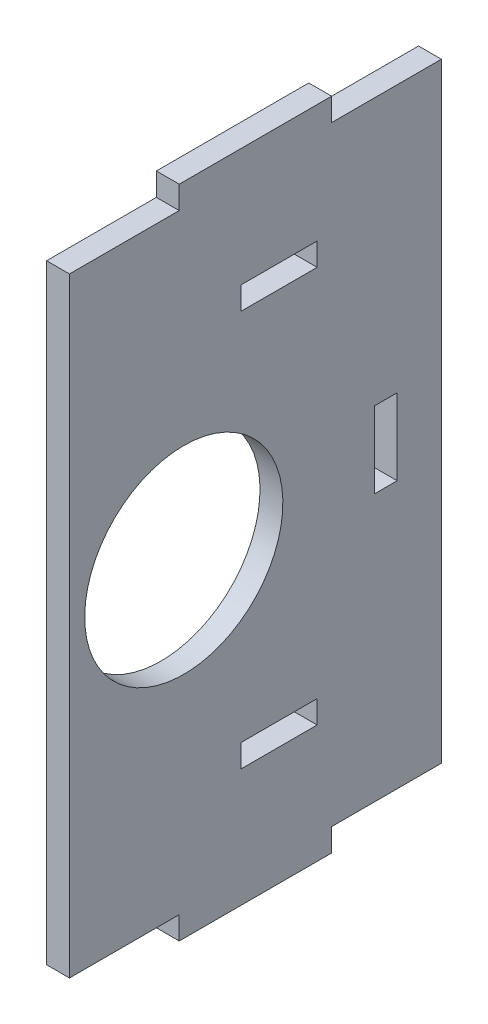
ISO-10303-21;
HEADER;
FILE_DESCRIPTION(('STEP AP214'),'2;1');
FILE_NAME('part.step','',(''),(''),'','','');
FILE_SCHEMA(('AUTOMOTIVE_DESIGN { 1 0 10303 214 1 1 1 1 }'));
ENDSEC;
DATA;
#1=APPLICATION_CONTEXT('core data for automotive mechanical design processes');
#2=APPLICATION_PROTOCOL_DEFINITION('international standard','automotive_design',2000,#1);
#3=PRODUCT_CONTEXT('',#1,'mechanical');
#4=PRODUCT('Part','Part','',(#3));
#5=PRODUCT_RELATED_PRODUCT_CATEGORY('part','',(#4));
#6=PRODUCT_DEFINITION_FORMATION('','',#4);
#7=PRODUCT_DEFINITION_CONTEXT('part definition',#1,'design');
#8=PRODUCT_DEFINITION('design','',#6,#7);
#9=PRODUCT_DEFINITION_SHAPE('','',#8);
#10=(LENGTH_UNIT() NAMED_UNIT(*) SI_UNIT(.MILLI.,.METRE.));
#11=(NAMED_UNIT(*) PLANE_ANGLE_UNIT() SI_UNIT($,.RADIAN.));
#12=(NAMED_UNIT(*) SI_UNIT($,.STERADIAN.) SOLID_ANGLE_UNIT());
#13=UNCERTAINTY_MEASURE_WITH_UNIT(LENGTH_MEASURE(1.E-05),#10,'distance_accuracy_value','');
#14=(GEOMETRIC_REPRESENTATION_CONTEXT(3) GLOBAL_UNCERTAINTY_ASSIGNED_CONTEXT((#13)) GLOBAL_UNIT_ASSIGNED_CONTEXT((#10,
#11,#12)) REPRESENTATION_CONTEXT('',''));
#15=CARTESIAN_POINT('',(0.,0.,0.));
#16=DIRECTION('',(0.,0.,1.));
#17=DIRECTION('',(1.,0.,0.));
#18=AXIS2_PLACEMENT_3D('',#15,#16,#17);
#19=CARTESIAN_POINT('',(-3.,-27.5,16.3));
#20=DIRECTION('',(0.,1.,0.));
#21=DIRECTION('',(0.,0.,1.));
#22=AXIS2_PLACEMENT_3D('',#19,#20,#21);
#23=PLANE('',#22);
#24=DIRECTION('',(0.,0.,1.));
#25=VECTOR('',#24,1.);
#26=CARTESIAN_POINT('',(0.,-27.5,16.3));
#27=LINE('',#26,#25);
#28=CARTESIAN_POINT('',(0.,-27.5,16.3));
#29=VERTEX_POINT('',#28);
#30=CARTESIAN_POINT('',(0.,-27.5,26.3));
#31=VERTEX_POINT('',#30);
#32=EDGE_CURVE('E292',#29,#31,#27,.T.);
#33=ORIENTED_EDGE('',*,*,#32,.F.);
#34=DIRECTION('',(1.,0.,0.));
#35=VECTOR('',#34,1.);
#36=CARTESIAN_POINT('',(-3.,-27.5,16.3));
#37=LINE('',#36,#35);
#38=CARTESIAN_POINT('',(-3.,-27.5,16.3));
#39=VERTEX_POINT('',#38);
#40=EDGE_CURVE('E197',#39,#29,#37,.T.);
#41=ORIENTED_EDGE('',*,*,#40,.F.);
#42=DIRECTION('',(0.,0.,1.));
#43=VECTOR('',#42,1.);
#44=CARTESIAN_POINT('',(-3.,-27.5,16.3));
#45=LINE('',#44,#43);
#46=CARTESIAN_POINT('',(-3.,-27.5,26.3));
#47=VERTEX_POINT('',#46);
#48=EDGE_CURVE('E193',#39,#47,#45,.T.);
#49=ORIENTED_EDGE('',*,*,#48,.T.);
#50=DIRECTION('',(1.,0.,0.));
#51=VECTOR('',#50,1.);
#52=CARTESIAN_POINT('',(-3.,-27.5,26.3));
#53=LINE('',#52,#51);
#54=EDGE_CURVE('E10',#47,#31,#53,.T.);
#55=ORIENTED_EDGE('',*,*,#54,.T.);
#56=EDGE_LOOP('',(#33,#41,#49,#55));
#57=FACE_BOUND('',#56,.T.);
#58=ADVANCED_FACE('F16',(#57),#23,.T.);
#59=CARTESIAN_POINT('',(-3.,-27.5,26.3));
#60=DIRECTION('',(0.,0.,-1.));
#61=DIRECTION('',(0.,1.,0.));
#62=AXIS2_PLACEMENT_3D('',#59,#60,#61);
#63=PLANE('',#62);
#64=DIRECTION('',(0.,1.,0.));
#65=VECTOR('',#64,1.);
#66=CARTESIAN_POINT('',(0.,-27.5,26.3));
#67=LINE('',#66,#65);
#68=CARTESIAN_POINT('',(0.,-24.5,26.3));
#69=VERTEX_POINT('',#68);
#70=EDGE_CURVE('E184',#31,#69,#67,.T.);
#71=ORIENTED_EDGE('',*,*,#70,.F.);
#72=ORIENTED_EDGE('',*,*,#54,.F.);
#73=DIRECTION('',(0.,1.,0.));
#74=VECTOR('',#73,1.);
#75=CARTESIAN_POINT('',(-3.,-27.5,26.3));
#76=LINE('',#75,#74);
#77=CARTESIAN_POINT('',(-3.,-24.5,26.3));
#78=VERTEX_POINT('',#77);
#79=EDGE_CURVE('E181',#47,#78,#76,.T.);
#80=ORIENTED_EDGE('',*,*,#79,.T.);
#81=DIRECTION('',(1.,0.,0.));
#82=VECTOR('',#81,1.);
#83=CARTESIAN_POINT('',(-3.,-24.5,26.3));
#84=LINE('',#83,#82);
#85=EDGE_CURVE('E26',#78,#69,#84,.T.);
#86=ORIENTED_EDGE('',*,*,#85,.T.);
#87=EDGE_LOOP('',(#71,#72,#80,#86));
#88=FACE_BOUND('',#87,.T.);
#89=ADVANCED_FACE('F180',(#88),#63,.T.);
#90=CARTESIAN_POINT('',(-3.,-24.5,26.3));
#91=DIRECTION('',(0.,-1.,0.));
#92=DIRECTION('',(0.,0.,-1.));
#93=AXIS2_PLACEMENT_3D('',#90,#91,#92);
#94=PLANE('',#93);
#95=DIRECTION('',(0.,0.,-1.));
#96=VECTOR('',#95,1.);
#97=CARTESIAN_POINT('',(0.,-24.5,26.3));
#98=LINE('',#97,#96);
#99=CARTESIAN_POINT('',(0.,-24.5,16.3));
#100=VERTEX_POINT('',#99);
#101=EDGE_CURVE('E299',#69,#100,#98,.T.);
#102=ORIENTED_EDGE('',*,*,#101,.F.);
#103=ORIENTED_EDGE('',*,*,#85,.F.);
#104=DIRECTION('',(0.,0.,-1.));
#105=VECTOR('',#104,1.);
#106=CARTESIAN_POINT('',(-3.,-24.5,26.3));
#107=LINE('',#106,#105);
#108=CARTESIAN_POINT('',(-3.,-24.5,16.3));
#109=VERTEX_POINT('',#108);
#110=EDGE_CURVE('E194',#78,#109,#107,.T.);
#111=ORIENTED_EDGE('',*,*,#110,.T.);
#112=DIRECTION('',(1.,0.,0.));
#113=VECTOR('',#112,1.);
#114=CARTESIAN_POINT('',(-3.,-24.5,16.3));
#115=LINE('',#114,#113);
#116=EDGE_CURVE('E107',#109,#100,#115,.T.);
#117=ORIENTED_EDGE('',*,*,#116,.T.);
#118=EDGE_LOOP('',(#102,#103,#111,#117));
#119=FACE_BOUND('',#118,.T.);
#120=ADVANCED_FACE('F417',(#119),#94,.T.);
#121=CARTESIAN_POINT('',(-3.,27.5,26.3));
#122=DIRECTION('',(0.,0.,1.));
#123=DIRECTION('',(0.,-1.,0.));
#124=AXIS2_PLACEMENT_3D('',#121,#122,#123);
#125=PLANE('',#124);
#126=DIRECTION('',(0.,-1.,0.));
#127=VECTOR('',#126,1.);
#128=CARTESIAN_POINT('',(0.,27.5,26.3));
#129=LINE('',#128,#127);
#130=CARTESIAN_POINT('',(0.,27.5,26.3));
#131=VERTEX_POINT('',#130);
#132=CARTESIAN_POINT('',(0.,24.5,26.3));
#133=VERTEX_POINT('',#132);
#134=EDGE_CURVE('E288',#131,#133,#129,.T.);
#135=ORIENTED_EDGE('',*,*,#134,.T.);
#136=DIRECTION('',(1.,0.,0.));
#137=VECTOR('',#136,1.);
#138=CARTESIAN_POINT('',(-3.,24.5,26.3));
#139=LINE('',#138,#137);
#140=CARTESIAN_POINT('',(-3.,24.5,26.3));
#141=VERTEX_POINT('',#140);
#142=EDGE_CURVE('E314',#141,#133,#139,.T.);
#143=ORIENTED_EDGE('',*,*,#142,.F.);
#144=DIRECTION('',(0.,-1.,0.));
#145=VECTOR('',#144,1.);
#146=CARTESIAN_POINT('',(-3.,27.5,26.3));
#147=LINE('',#146,#145);
#148=CARTESIAN_POINT('',(-3.,27.5,26.3));
#149=VERTEX_POINT('',#148);
#150=EDGE_CURVE('E200',#149,#141,#147,.T.);
#151=ORIENTED_EDGE('',*,*,#150,.F.);
#152=DIRECTION('',(1.,0.,0.));
#153=VECTOR('',#152,1.);
#154=CARTESIAN_POINT('',(-3.,27.5,26.3));
#155=LINE('',#154,#153);
#156=EDGE_CURVE('E313',#149,#131,#155,.T.);
#157=ORIENTED_EDGE('',*,*,#156,.T.);
#158=EDGE_LOOP('',(#135,#143,#151,#157));
#159=FACE_BOUND('',#158,.T.);
#160=ADVANCED_FACE('F409',(#159),#125,.F.);
#161=CARTESIAN_POINT('',(-3.,27.5,16.3));
#162=DIRECTION('',(0.,1.,0.));
#163=DIRECTION('',(0.,0.,1.));
#164=AXIS2_PLACEMENT_3D('',#161,#162,#163);
#165=PLANE('',#164);
#166=DIRECTION('',(0.,0.,1.));
#167=VECTOR('',#166,1.);
#168=CARTESIAN_POINT('',(0.,27.5,16.3));
#169=LINE('',#168,#167);
#170=CARTESIAN_POINT('',(0.,27.5,16.3));
#171=VERTEX_POINT('',#170);
#172=EDGE_CURVE('E276',#171,#131,#169,.T.);
#173=ORIENTED_EDGE('',*,*,#172,.T.);
#174=ORIENTED_EDGE('',*,*,#156,.F.);
#175=DIRECTION('',(0.,0.,1.));
#176=VECTOR('',#175,1.);
#177=CARTESIAN_POINT('',(-3.,27.5,16.3));
#178=LINE('',#177,#176);
#179=CARTESIAN_POINT('',(-3.,27.5,16.3));
#180=VERTEX_POINT('',#179);
#181=EDGE_CURVE('E389',#180,#149,#178,.T.);
#182=ORIENTED_EDGE('',*,*,#181,.F.);
#183=DIRECTION('',(1.,0.,0.));
#184=VECTOR('',#183,1.);
#185=CARTESIAN_POINT('',(-3.,27.5,16.3));
#186=LINE('',#185,#184);
#187=EDGE_CURVE('E318',#180,#171,#186,.T.);
#188=ORIENTED_EDGE('',*,*,#187,.T.);
#189=EDGE_LOOP('',(#173,#174,#182,#188));
#190=FACE_BOUND('',#189,.T.);
#191=ADVANCED_FACE('F407',(#190),#165,.F.);
#192=CARTESIAN_POINT('',(-3.,24.5,16.3));
#193=DIRECTION('',(0.,0.,-1.));
#194=DIRECTION('',(-1.,0.,0.));
#195=AXIS2_PLACEMENT_3D('',#192,#193,#194);
#196=PLANE('',#195);
#197=DIRECTION('',(0.,1.,0.));
#198=VECTOR('',#197,1.);
#199=CARTESIAN_POINT('',(0.,24.5,16.3));
#200=LINE('',#199,#198);
#201=CARTESIAN_POINT('',(0.,24.5,16.3));
#202=VERTEX_POINT('',#201);
#203=EDGE_CURVE('E280',#202,#171,#200,.T.);
#204=ORIENTED_EDGE('',*,*,#203,.T.);
#205=ORIENTED_EDGE('',*,*,#187,.F.);
#206=DIRECTION('',(0.,1.,0.));
#207=VECTOR('',#206,1.);
#208=CARTESIAN_POINT('',(-3.,24.5,16.3));
#209=LINE('',#208,#207);
#210=CARTESIAN_POINT('',(-3.,24.5,16.3));
#211=VERTEX_POINT('',#210);
#212=EDGE_CURVE('E392',#211,#180,#209,.T.);
#213=ORIENTED_EDGE('',*,*,#212,.F.);
#214=DIRECTION('',(1.,0.,0.));
#215=VECTOR('',#214,1.);
#216=CARTESIAN_POINT('',(-3.,24.5,16.3));
#217=LINE('',#216,#215);
#218=EDGE_CURVE('E316',#211,#202,#217,.T.);
#219=ORIENTED_EDGE('',*,*,#218,.T.);
#220=EDGE_LOOP('',(#204,#205,#213,#219));
#221=FACE_BOUND('',#220,.T.);
#222=ADVANCED_FACE('F403',(#221),#196,.F.);
#223=CARTESIAN_POINT('',(-3.,40.,48.8));
#224=DIRECTION('',(0.,0.,1.));
#225=DIRECTION('',(1.,0.,0.));
#226=AXIS2_PLACEMENT_3D('',#223,#224,#225);
#227=PLANE('',#226);
#228=DIRECTION('',(0.,-1.,0.));
#229=VECTOR('',#228,1.);
#230=CARTESIAN_POINT('',(0.,40.,48.8));
#231=LINE('',#230,#229);
#232=CARTESIAN_POINT('',(0.,40.,48.8));
#233=VERTEX_POINT('',#232);
#234=CARTESIAN_POINT('',(0.,-40.,48.8));
#235=VERTEX_POINT('',#234);
#236=EDGE_CURVE('E217',#233,#235,#231,.T.);
#237=ORIENTED_EDGE('',*,*,#236,.F.);
#238=DIRECTION('',(1.,0.,0.));
#239=VECTOR('',#238,1.);
#240=CARTESIAN_POINT('',(-3.,40.,48.8));
#241=LINE('',#240,#239);
#242=CARTESIAN_POINT('',(-3.,40.,48.8));
#243=VERTEX_POINT('',#242);
#244=EDGE_CURVE('E327',#243,#233,#241,.T.);
#245=ORIENTED_EDGE('',*,*,#244,.F.);
#246=DIRECTION('',(0.,-1.,0.));
#247=VECTOR('',#246,1.);
#248=CARTESIAN_POINT('',(-3.,40.,48.8));
#249=LINE('',#248,#247);
#250=CARTESIAN_POINT('',(-3.,-40.,48.8));
#251=VERTEX_POINT('',#250);
#252=EDGE_CURVE('E309',#243,#251,#249,.T.);
#253=ORIENTED_EDGE('',*,*,#252,.T.);
#254=DIRECTION('',(1.,0.,0.));
#255=VECTOR('',#254,1.);
#256=CARTESIAN_POINT('',(-3.,-40.,48.8));
#257=LINE('',#256,#255);
#258=EDGE_CURVE('E20',#251,#235,#257,.T.);
#259=ORIENTED_EDGE('',*,*,#258,.T.);
#260=EDGE_LOOP('',(#237,#245,#253,#259));
#261=FACE_BOUND('',#260,.T.);
#262=ADVANCED_FACE('F18',(#261),#227,.T.);
#263=CARTESIAN_POINT('',(-3.,-40.,48.8));
#264=DIRECTION('',(0.,-1.,0.));
#265=DIRECTION('',(0.,0.,-1.));
#266=AXIS2_PLACEMENT_3D('',#263,#264,#265);
#267=PLANE('',#266);
#268=DIRECTION('',(0.,0.,-1.));
#269=VECTOR('',#268,1.);
#270=CARTESIAN_POINT('',(0.,-40.,48.8));
#271=LINE('',#270,#269);
#272=CARTESIAN_POINT('',(0.,-40.,34.4));
#273=VERTEX_POINT('',#272);
#274=EDGE_CURVE('E212',#235,#273,#271,.T.);
#275=ORIENTED_EDGE('',*,*,#274,.F.);
#276=ORIENTED_EDGE('',*,*,#258,.F.);
#277=DIRECTION('',(0.,0.,-1.));
#278=VECTOR('',#277,1.);
#279=CARTESIAN_POINT('',(-3.,-40.,48.8));
#280=LINE('',#279,#278);
#281=CARTESIAN_POINT('',(-3.,-40.,34.4));
#282=VERTEX_POINT('',#281);
#283=EDGE_CURVE('E372',#251,#282,#280,.T.);
#284=ORIENTED_EDGE('',*,*,#283,.T.);
#285=DIRECTION('',(1.,0.,0.));
#286=VECTOR('',#285,1.);
#287=CARTESIAN_POINT('',(-3.,-40.,34.4));
#288=LINE('',#287,#286);
#289=EDGE_CURVE('E347',#282,#273,#288,.T.);
#290=ORIENTED_EDGE('',*,*,#289,.T.);
#291=EDGE_LOOP('',(#275,#276,#284,#290));
#292=FACE_BOUND('',#291,.T.);
#293=ADVANCED_FACE('F353',(#292),#267,.T.);
#294=CARTESIAN_POINT('',(-3.,-40.,34.4));
#295=DIRECTION('',(0.,0.,1.));
#296=DIRECTION('',(1.,0.,0.));
#297=AXIS2_PLACEMENT_3D('',#294,#295,#296);
#298=PLANE('',#297);
#299=DIRECTION('',(0.,-1.,0.));
#300=VECTOR('',#299,1.);
#301=CARTESIAN_POINT('',(0.,-40.,34.4));
#302=LINE('',#301,#300);
#303=CARTESIAN_POINT('',(0.,-43.,34.4));
#304=VERTEX_POINT('',#303);
#305=EDGE_CURVE('E216',#273,#304,#302,.T.);
#306=ORIENTED_EDGE('',*,*,#305,.F.);
#307=ORIENTED_EDGE('',*,*,#289,.F.);
#308=DIRECTION('',(0.,-1.,0.));
#309=VECTOR('',#308,1.);
#310=CARTESIAN_POINT('',(-3.,-40.,34.4));
#311=LINE('',#310,#309);
#312=CARTESIAN_POINT('',(-3.,-43.,34.4));
#313=VERTEX_POINT('',#312);
#314=EDGE_CURVE('E374',#282,#313,#311,.T.);
#315=ORIENTED_EDGE('',*,*,#314,.T.);
#316=DIRECTION('',(1.,0.,0.));
#317=VECTOR('',#316,1.);
#318=CARTESIAN_POINT('',(-3.,-43.,34.4));
#319=LINE('',#318,#317);
#320=EDGE_CURVE('E346',#313,#304,#319,.T.);
#321=ORIENTED_EDGE('',*,*,#320,.T.);
#322=EDGE_LOOP('',(#306,#307,#315,#321));
#323=FACE_BOUND('',#322,.T.);
#324=ADVANCED_FACE('F489',(#323),#298,.T.);
#325=CARTESIAN_POINT('',(-3.,-43.,34.4));
#326=DIRECTION('',(0.,-1.,0.));
#327=DIRECTION('',(0.,0.,-1.));
#328=AXIS2_PLACEMENT_3D('',#325,#326,#327);
#329=PLANE('',#328);
#330=DIRECTION('',(0.,0.,-1.));
#331=VECTOR('',#330,1.);
#332=CARTESIAN_POINT('',(0.,-43.,34.4));
#333=LINE('',#332,#331);
#334=CARTESIAN_POINT('',(0.,-43.,14.4));
#335=VERTEX_POINT('',#334);
#336=EDGE_CURVE('E221',#304,#335,#333,.T.);
#337=ORIENTED_EDGE('',*,*,#336,.F.);
#338=ORIENTED_EDGE('',*,*,#320,.F.);
#339=DIRECTION('',(0.,0.,-1.));
#340=VECTOR('',#339,1.);
#341=CARTESIAN_POINT('',(-3.,-43.,34.4));
#342=LINE('',#341,#340);
#343=CARTESIAN_POINT('',(-3.,-43.,14.4));
#344=VERTEX_POINT('',#343);
#345=EDGE_CURVE('E855',#313,#344,#342,.T.);
#346=ORIENTED_EDGE('',*,*,#345,.T.);
#347=DIRECTION('',(1.,0.,0.));
#348=VECTOR('',#347,1.);
#349=CARTESIAN_POINT('',(-3.,-43.,14.4));
#350=LINE('',#349,#348);
#351=EDGE_CURVE('E344',#344,#335,#350,.T.);
#352=ORIENTED_EDGE('',*,*,#351,.T.);
#353=EDGE_LOOP('',(#337,#338,#346,#352));
#354=FACE_BOUND('',#353,.T.);
#355=ADVANCED_FACE('F485',(#354),#329,.T.);
#356=CARTESIAN_POINT('',(-3.,-43.,14.4));
#357=DIRECTION('',(0.,0.,-1.));
#358=DIRECTION('',(0.,1.,0.));
#359=AXIS2_PLACEMENT_3D('',#356,#357,#358);
#360=PLANE('',#359);
#361=DIRECTION('',(0.,1.,0.));
#362=VECTOR('',#361,1.);
#363=CARTESIAN_POINT('',(0.,-43.,14.4));
#364=LINE('',#363,#362);
#365=CARTESIAN_POINT('',(0.,-40.,14.4));
#366=VERTEX_POINT('',#365);
#367=EDGE_CURVE('E225',#335,#366,#364,.T.);
#368=ORIENTED_EDGE('',*,*,#367,.F.);
#369=ORIENTED_EDGE('',*,*,#351,.F.);
#370=DIRECTION('',(0.,1.,0.));
#371=VECTOR('',#370,1.);
#372=CARTESIAN_POINT('',(-3.,-43.,14.4));
#373=LINE('',#372,#371);
#374=CARTESIAN_POINT('',(-3.,-40.,14.4));
#375=VERTEX_POINT('',#374);
#376=EDGE_CURVE('E859',#344,#375,#373,.T.);
#377=ORIENTED_EDGE('',*,*,#376,.T.);
#378=DIRECTION('',(1.,0.,0.));
#379=VECTOR('',#378,1.);
#380=CARTESIAN_POINT('',(-3.,-40.,14.4));
#381=LINE('',#380,#379);
#382=EDGE_CURVE('E342',#375,#366,#381,.T.);
#383=ORIENTED_EDGE('',*,*,#382,.T.);
#384=EDGE_LOOP('',(#368,#369,#377,#383));
#385=FACE_BOUND('',#384,.T.);
#386=ADVANCED_FACE('F481',(#385),#360,.T.);
#387=CARTESIAN_POINT('',(-3.,-40.,14.4));
#388=DIRECTION('',(0.,-1.,0.));
#389=DIRECTION('',(0.,0.,-1.));
#390=AXIS2_PLACEMENT_3D('',#387,#388,#389);
#391=PLANE('',#390);
#392=DIRECTION('',(0.,0.,-1.));
#393=VECTOR('',#392,1.);
#394=CARTESIAN_POINT('',(0.,-40.,14.4));
#395=LINE('',#394,#393);
#396=CARTESIAN_POINT('',(0.,-40.,0.));
#397=VERTEX_POINT('',#396);
#398=EDGE_CURVE('E229',#366,#397,#395,.T.);
#399=ORIENTED_EDGE('',*,*,#398,.F.);
#400=ORIENTED_EDGE('',*,*,#382,.F.);
#401=DIRECTION('',(0.,0.,-1.));
#402=VECTOR('',#401,1.);
#403=CARTESIAN_POINT('',(-3.,-40.,14.4));
#404=LINE('',#403,#402);
#405=CARTESIAN_POINT('',(-3.,-40.,0.));
#406=VERTEX_POINT('',#405);
#407=EDGE_CURVE('E883',#375,#406,#404,.T.);
#408=ORIENTED_EDGE('',*,*,#407,.T.);
#409=DIRECTION('',(1.,0.,0.));
#410=VECTOR('',#409,1.);
#411=CARTESIAN_POINT('',(-3.,-40.,0.));
#412=LINE('',#411,#410);
#413=EDGE_CURVE('E340',#406,#397,#412,.T.);
#414=ORIENTED_EDGE('',*,*,#413,.T.);
#415=EDGE_LOOP('',(#399,#400,#408,#414));
#416=FACE_BOUND('',#415,.T.);
#417=ADVANCED_FACE('F477',(#416),#391,.T.);
#418=CARTESIAN_POINT('',(-3.,-40.,0.));
#419=DIRECTION('',(0.,0.,-1.));
#420=DIRECTION('',(-1.,0.,0.));
#421=AXIS2_PLACEMENT_3D('',#418,#419,#420);
#422=PLANE('',#421);
#423=DIRECTION('',(0.,1.,0.));
#424=VECTOR('',#423,1.);
#425=CARTESIAN_POINT('',(0.,-40.,0.));
#426=LINE('',#425,#424);
#427=CARTESIAN_POINT('',(0.,40.,0.));
#428=VERTEX_POINT('',#427);
#429=EDGE_CURVE('E233',#397,#428,#426,.T.);
#430=ORIENTED_EDGE('',*,*,#429,.F.);
#431=ORIENTED_EDGE('',*,*,#413,.F.);
#432=DIRECTION('',(0.,1.,0.));
#433=VECTOR('',#432,1.);
#434=CARTESIAN_POINT('',(-3.,-40.,0.));
#435=LINE('',#434,#433);
#436=CARTESIAN_POINT('',(-3.,40.,0.));
#437=VERTEX_POINT('',#436);
#438=EDGE_CURVE('E866',#406,#437,#435,.T.);
#439=ORIENTED_EDGE('',*,*,#438,.T.);
#440=DIRECTION('',(1.,0.,0.));
#441=VECTOR('',#440,1.);
#442=CARTESIAN_POINT('',(-3.,40.,0.));
#443=LINE('',#442,#441);
#444=EDGE_CURVE('E338',#437,#428,#443,.T.);
#445=ORIENTED_EDGE('',*,*,#444,.T.);
#446=EDGE_LOOP('',(#430,#431,#439,#445));
#447=FACE_BOUND('',#446,.T.);
#448=ADVANCED_FACE('F473',(#447),#422,.T.);
#449=CARTESIAN_POINT('',(-3.,40.,0.));
#450=DIRECTION('',(0.,1.,0.));
#451=DIRECTION('',(0.,0.,1.));
#452=AXIS2_PLACEMENT_3D('',#449,#450,#451);
#453=PLANE('',#452);
#454=DIRECTION('',(0.,0.,1.));
#455=VECTOR('',#454,1.);
#456=CARTESIAN_POINT('',(0.,40.,0.));
#457=LINE('',#456,#455);
#458=CARTESIAN_POINT('',(0.,40.,14.4));
#459=VERTEX_POINT('',#458);
#460=EDGE_CURVE('E237',#428,#459,#457,.T.);
#461=ORIENTED_EDGE('',*,*,#460,.F.);
#462=ORIENTED_EDGE('',*,*,#444,.F.);
#463=DIRECTION('',(0.,0.,1.));
#464=VECTOR('',#463,1.);
#465=CARTESIAN_POINT('',(-3.,40.,0.));
#466=LINE('',#465,#464);
#467=CARTESIAN_POINT('',(-3.,40.,14.4));
#468=VERTEX_POINT('',#467);
#469=EDGE_CURVE('E870',#437,#468,#466,.T.);
#470=ORIENTED_EDGE('',*,*,#469,.T.);
#471=DIRECTION('',(1.,0.,0.));
#472=VECTOR('',#471,1.);
#473=CARTESIAN_POINT('',(-3.,40.,14.4));
#474=LINE('',#473,#472);
#475=EDGE_CURVE('E336',#468,#459,#474,.T.);
#476=ORIENTED_EDGE('',*,*,#475,.T.);
#477=EDGE_LOOP('',(#461,#462,#470,#476));
#478=FACE_BOUND('',#477,.T.);
#479=ADVANCED_FACE('F469',(#478),#453,.T.);
#480=CARTESIAN_POINT('',(-3.,40.,14.4));
#481=DIRECTION('',(0.,0.,-1.));
#482=DIRECTION('',(0.,1.,0.));
#483=AXIS2_PLACEMENT_3D('',#480,#481,#482);
#484=PLANE('',#483);
#485=DIRECTION('',(0.,1.,0.));
#486=VECTOR('',#485,1.);
#487=CARTESIAN_POINT('',(0.,40.,14.4));
#488=LINE('',#487,#486);
#489=CARTESIAN_POINT('',(0.,43.,14.4));
#490=VERTEX_POINT('',#489);
#491=EDGE_CURVE('E241',#459,#490,#488,.T.);
#492=ORIENTED_EDGE('',*,*,#491,.F.);
#493=ORIENTED_EDGE('',*,*,#475,.F.);
#494=DIRECTION('',(0.,1.,0.));
#495=VECTOR('',#494,1.);
#496=CARTESIAN_POINT('',(-3.,40.,14.4));
#497=LINE('',#496,#495);
#498=CARTESIAN_POINT('',(-3.,43.,14.4));
#499=VERTEX_POINT('',#498);
#500=EDGE_CURVE('E877',#468,#499,#497,.T.);
#501=ORIENTED_EDGE('',*,*,#500,.T.);
#502=DIRECTION('',(1.,0.,0.));
#503=VECTOR('',#502,1.);
#504=CARTESIAN_POINT('',(-3.,43.,14.4));
#505=LINE('',#504,#503);
#506=EDGE_CURVE('E334',#499,#490,#505,.T.);
#507=ORIENTED_EDGE('',*,*,#506,.T.);
#508=EDGE_LOOP('',(#492,#493,#501,#507));
#509=FACE_BOUND('',#508,.T.);
#510=ADVANCED_FACE('F465',(#509),#484,.T.);
#511=CARTESIAN_POINT('',(-3.,43.,14.4));
#512=DIRECTION('',(0.,1.,0.));
#513=DIRECTION('',(0.,0.,1.));
#514=AXIS2_PLACEMENT_3D('',#511,#512,#513);
#515=PLANE('',#514);
#516=DIRECTION('',(0.,0.,1.));
#517=VECTOR('',#516,1.);
#518=CARTESIAN_POINT('',(0.,43.,14.4));
#519=LINE('',#518,#517);
#520=CARTESIAN_POINT('',(0.,43.,34.4));
#521=VERTEX_POINT('',#520);
#522=EDGE_CURVE('E245',#490,#521,#519,.T.);
#523=ORIENTED_EDGE('',*,*,#522,.F.);
#524=ORIENTED_EDGE('',*,*,#506,.F.);
#525=DIRECTION('',(0.,0.,1.));
#526=VECTOR('',#525,1.);
#527=CARTESIAN_POINT('',(-3.,43.,14.4));
#528=LINE('',#527,#526);
#529=CARTESIAN_POINT('',(-3.,43.,34.4));
#530=VERTEX_POINT('',#529);
#531=EDGE_CURVE('E876',#499,#530,#528,.T.);
#532=ORIENTED_EDGE('',*,*,#531,.T.);
#533=DIRECTION('',(1.,0.,0.));
#534=VECTOR('',#533,1.);
#535=CARTESIAN_POINT('',(-3.,43.,34.4));
#536=LINE('',#535,#534);
#537=EDGE_CURVE('E332',#530,#521,#536,.T.);
#538=ORIENTED_EDGE('',*,*,#537,.T.);
#539=EDGE_LOOP('',(#523,#524,#532,#538));
#540=FACE_BOUND('',#539,.T.);
#541=ADVANCED_FACE('F461',(#540),#515,.T.);
#542=CARTESIAN_POINT('',(-3.,43.,34.4));
#543=DIRECTION('',(0.,0.,1.));
#544=DIRECTION('',(1.,0.,0.));
#545=AXIS2_PLACEMENT_3D('',#542,#543,#544);
#546=PLANE('',#545);
#547=DIRECTION('',(0.,-1.,0.));
#548=VECTOR('',#547,1.);
#549=CARTESIAN_POINT('',(0.,43.,34.4));
#550=LINE('',#549,#548);
#551=CARTESIAN_POINT('',(0.,40.,34.4));
#552=VERTEX_POINT('',#551);
#553=EDGE_CURVE('E249',#521,#552,#550,.T.);
#554=ORIENTED_EDGE('',*,*,#553,.F.);
#555=ORIENTED_EDGE('',*,*,#537,.F.);
#556=DIRECTION('',(0.,-1.,0.));
#557=VECTOR('',#556,1.);
#558=CARTESIAN_POINT('',(-3.,43.,34.4));
#559=LINE('',#558,#557);
#560=CARTESIAN_POINT('',(-3.,40.,34.4));
#561=VERTEX_POINT('',#560);
#562=EDGE_CURVE('E368',#530,#561,#559,.T.);
#563=ORIENTED_EDGE('',*,*,#562,.T.);
#564=DIRECTION('',(1.,0.,0.));
#565=VECTOR('',#564,1.);
#566=CARTESIAN_POINT('',(-3.,40.,34.4));
#567=LINE('',#566,#565);
#568=EDGE_CURVE('E330',#561,#552,#567,.T.);
#569=ORIENTED_EDGE('',*,*,#568,.T.);
#570=EDGE_LOOP('',(#554,#555,#563,#569));
#571=FACE_BOUND('',#570,.T.);
#572=ADVANCED_FACE('F455',(#571),#546,.T.);
#573=CARTESIAN_POINT('',(-3.,5.,5.8));
#574=DIRECTION('',(0.,0.,1.));
#575=DIRECTION('',(1.,0.,0.));
#576=AXIS2_PLACEMENT_3D('',#573,#574,#575);
#577=PLANE('',#576);
#578=DIRECTION('',(0.,-1.,0.));
#579=VECTOR('',#578,1.);
#580=CARTESIAN_POINT('',(0.,5.,5.8));
#581=LINE('',#580,#579);
#582=CARTESIAN_POINT('',(0.,5.,5.8));
#583=VERTEX_POINT('',#582);
#584=CARTESIAN_POINT('',(0.,-5.,5.8));
#585=VERTEX_POINT('',#584);
#586=EDGE_CURVE('E257',#583,#585,#581,.T.);
#587=ORIENTED_EDGE('',*,*,#586,.F.);
#588=DIRECTION('',(1.,0.,0.));
#589=VECTOR('',#588,1.);
#590=CARTESIAN_POINT('',(-3.,5.,5.8));
#591=LINE('',#590,#589);
#592=CARTESIAN_POINT('',(-3.,5.,5.8));
#593=VERTEX_POINT('',#592);
#594=EDGE_CURVE('E211',#593,#583,#591,.T.);
#595=ORIENTED_EDGE('',*,*,#594,.F.);
#596=DIRECTION('',(0.,-1.,0.));
#597=VECTOR('',#596,1.);
#598=CARTESIAN_POINT('',(-3.,5.,5.8));
#599=LINE('',#598,#597);
#600=CARTESIAN_POINT('',(-3.,-5.,5.8));
#601=VERTEX_POINT('',#600);
#602=EDGE_CURVE('E367',#593,#601,#599,.T.);
#603=ORIENTED_EDGE('',*,*,#602,.T.);
#604=DIRECTION('',(1.,0.,0.));
#605=VECTOR('',#604,1.);
#606=CARTESIAN_POINT('',(-3.,-5.,5.8));
#607=LINE('',#606,#605);
#608=EDGE_CURVE('E323',#601,#585,#607,.T.);
#609=ORIENTED_EDGE('',*,*,#608,.T.);
#610=EDGE_LOOP('',(#587,#595,#603,#609));
#611=FACE_BOUND('',#610,.T.);
#612=ADVANCED_FACE('F443',(#611),#577,.T.);
#613=CARTESIAN_POINT('',(-3.,-5.,5.8));
#614=DIRECTION('',(0.,1.,0.));
#615=DIRECTION('',(0.,0.,1.));
#616=AXIS2_PLACEMENT_3D('',#613,#614,#615);
#617=PLANE('',#616);
#618=DIRECTION('',(0.,0.,1.));
#619=VECTOR('',#618,1.);
#620=CARTESIAN_POINT('',(0.,-5.,5.8));
#621=LINE('',#620,#619);
#622=CARTESIAN_POINT('',(0.,-5.,8.8));
#623=VERTEX_POINT('',#622);
#624=EDGE_CURVE('E272',#585,#623,#621,.T.);
#625=ORIENTED_EDGE('',*,*,#624,.F.);
#626=ORIENTED_EDGE('',*,*,#608,.F.);
#627=DIRECTION('',(0.,0.,1.));
#628=VECTOR('',#627,1.);
#629=CARTESIAN_POINT('',(-3.,-5.,5.8));
#630=LINE('',#629,#628);
#631=CARTESIAN_POINT('',(-3.,-5.,8.8));
#632=VERTEX_POINT('',#631);
#633=EDGE_CURVE('E386',#601,#632,#630,.T.);
#634=ORIENTED_EDGE('',*,*,#633,.T.);
#635=DIRECTION('',(1.,0.,0.));
#636=VECTOR('',#635,1.);
#637=CARTESIAN_POINT('',(-3.,-5.,8.8));
#638=LINE('',#637,#636);
#639=EDGE_CURVE('E321',#632,#623,#638,.T.);
#640=ORIENTED_EDGE('',*,*,#639,.T.);
#641=EDGE_LOOP('',(#625,#626,#634,#640));
#642=FACE_BOUND('',#641,.T.);
#643=ADVANCED_FACE('F440',(#642),#617,.T.);
#644=CARTESIAN_POINT('',(-3.,-5.,8.8));
#645=DIRECTION('',(0.,0.,-1.));
#646=DIRECTION('',(-1.,0.,0.));
#647=AXIS2_PLACEMENT_3D('',#644,#645,#646);
#648=PLANE('',#647);
#649=DIRECTION('',(0.,1.,0.));
#650=VECTOR('',#649,1.);
#651=CARTESIAN_POINT('',(0.,-5.,8.8));
#652=LINE('',#651,#650);
#653=CARTESIAN_POINT('',(0.,5.,8.8));
#654=VERTEX_POINT('',#653);
#655=EDGE_CURVE('E268',#623,#654,#652,.T.);
#656=ORIENTED_EDGE('',*,*,#655,.F.);
#657=ORIENTED_EDGE('',*,*,#639,.F.);
#658=DIRECTION('',(0.,1.,0.));
#659=VECTOR('',#658,1.);
#660=CARTESIAN_POINT('',(-3.,-5.,8.8));
#661=LINE('',#660,#659);
#662=CARTESIAN_POINT('',(-3.,5.,8.8));
#663=VERTEX_POINT('',#662);
#664=EDGE_CURVE('E383',#632,#663,#661,.T.);
#665=ORIENTED_EDGE('',*,*,#664,.T.);
#666=DIRECTION('',(1.,0.,0.));
#667=VECTOR('',#666,1.);
#668=CARTESIAN_POINT('',(-3.,5.,8.8));
#669=LINE('',#668,#667);
#670=EDGE_CURVE('E324',#663,#654,#669,.T.);
#671=ORIENTED_EDGE('',*,*,#670,.T.);
#672=EDGE_LOOP('',(#656,#657,#665,#671));
#673=FACE_BOUND('',#672,.T.);
#674=ADVANCED_FACE('F435',(#673),#648,.T.);
#675=CARTESIAN_POINT('',(-3.,24.5,26.3));
#676=DIRECTION('',(0.,-1.,0.));
#677=DIRECTION('',(0.,0.,-1.));
#678=AXIS2_PLACEMENT_3D('',#675,#676,#677);
#679=PLANE('',#678);
#680=DIRECTION('',(0.,0.,-1.));
#681=VECTOR('',#680,1.);
#682=CARTESIAN_POINT('',(0.,24.5,26.3));
#683=LINE('',#682,#681);
#684=EDGE_CURVE('E284',#133,#202,#683,.T.);
#685=ORIENTED_EDGE('',*,*,#684,.T.);
#686=ORIENTED_EDGE('',*,*,#218,.F.);
#687=DIRECTION('',(0.,0.,-1.));
#688=VECTOR('',#687,1.);
#689=CARTESIAN_POINT('',(-3.,24.5,26.3));
#690=LINE('',#689,#688);
#691=EDGE_CURVE('E204',#141,#211,#690,.T.);
#692=ORIENTED_EDGE('',*,*,#691,.F.);
#693=ORIENTED_EDGE('',*,*,#142,.T.);
#694=EDGE_LOOP('',(#685,#686,#692,#693));
#695=FACE_BOUND('',#694,.T.);
#696=ADVANCED_FACE('F399',(#695),#679,.F.);
#697=CARTESIAN_POINT('',(-3.,40.,34.4));
#698=DIRECTION('',(0.,1.,0.));
#699=DIRECTION('',(0.,0.,1.));
#700=AXIS2_PLACEMENT_3D('',#697,#698,#699);
#701=PLANE('',#700);
#702=DIRECTION('',(0.,0.,1.));
#703=VECTOR('',#702,1.);
#704=CARTESIAN_POINT('',(0.,40.,34.4));
#705=LINE('',#704,#703);
#706=EDGE_CURVE('E253',#552,#233,#705,.T.);
#707=ORIENTED_EDGE('',*,*,#706,.F.);
#708=ORIENTED_EDGE('',*,*,#568,.F.);
#709=DIRECTION('',(0.,0.,1.));
#710=VECTOR('',#709,1.);
#711=CARTESIAN_POINT('',(-3.,40.,34.4));
#712=LINE('',#711,#710);
#713=EDGE_CURVE('E364',#561,#243,#712,.T.);
#714=ORIENTED_EDGE('',*,*,#713,.T.);
#715=ORIENTED_EDGE('',*,*,#244,.T.);
#716=EDGE_LOOP('',(#707,#708,#714,#715));
#717=FACE_BOUND('',#716,.T.);
#718=ADVANCED_FACE('F360',(#717),#701,.T.);
#719=CARTESIAN_POINT('',(-3.,5.,8.8));
#720=DIRECTION('',(0.,-1.,0.));
#721=DIRECTION('',(0.,0.,-1.));
#722=AXIS2_PLACEMENT_3D('',#719,#720,#721);
#723=PLANE('',#722);
#724=DIRECTION('',(0.,0.,-1.));
#725=VECTOR('',#724,1.);
#726=CARTESIAN_POINT('',(0.,5.,8.8));
#727=LINE('',#726,#725);
#728=EDGE_CURVE('E264',#654,#583,#727,.T.);
#729=ORIENTED_EDGE('',*,*,#728,.F.);
#730=ORIENTED_EDGE('',*,*,#670,.F.);
#731=DIRECTION('',(0.,0.,-1.));
#732=VECTOR('',#731,1.);
#733=CARTESIAN_POINT('',(-3.,5.,8.8));
#734=LINE('',#733,#732);
#735=EDGE_CURVE('E380',#663,#593,#734,.T.);
#736=ORIENTED_EDGE('',*,*,#735,.T.);
#737=ORIENTED_EDGE('',*,*,#594,.T.);
#738=EDGE_LOOP('',(#729,#730,#736,#737));
#739=FACE_BOUND('',#738,.T.);
#740=ADVANCED_FACE('F448',(#739),#723,.T.);
#741=CARTESIAN_POINT('',(-3.,0.,33.8));
#742=DIRECTION('',(1.,0.,0.));
#743=DIRECTION('',(0.,0.,-1.));
#744=AXIS2_PLACEMENT_3D('',#741,#742,#743);
#745=CYLINDRICAL_SURFACE('',#744,13.);
#746=CARTESIAN_POINT('',(-3.,0.,33.8));
#747=DIRECTION('',(1.,0.,0.));
#748=DIRECTION('',(0.,1.,0.));
#749=AXIS2_PLACEMENT_3D('',#746,#747,#748);
#750=CIRCLE('',#749,13.);
#751=CARTESIAN_POINT('',(-3.,13.,33.8));
#752=VERTEX_POINT('',#751);
#753=EDGE_CURVE('E195',#752,#752,#750,.T.);
#754=ORIENTED_EDGE('',*,*,#753,.F.);
#755=EDGE_LOOP('',(#754));
#756=FACE_BOUND('',#755,.T.);
#757=CARTESIAN_POINT('',(0.,0.,33.8));
#758=DIRECTION('',(1.,0.,0.));
#759=DIRECTION('',(0.,1.,0.));
#760=AXIS2_PLACEMENT_3D('',#757,#758,#759);
#761=CIRCLE('',#760,13.);
#762=CARTESIAN_POINT('',(0.,13.,33.8));
#763=VERTEX_POINT('',#762);
#764=EDGE_CURVE('E305',#763,#763,#761,.T.);
#765=ORIENTED_EDGE('',*,*,#764,.T.);
#766=EDGE_LOOP('',(#765));
#767=FACE_BOUND('',#766,.T.);
#768=ADVANCED_FACE('F451',(#756,#767),#745,.F.);
#769=CARTESIAN_POINT('',(-3.,-24.5,16.3));
#770=DIRECTION('',(0.,0.,1.));
#771=DIRECTION('',(1.,0.,0.));
#772=AXIS2_PLACEMENT_3D('',#769,#770,#771);
#773=PLANE('',#772);
#774=DIRECTION('',(0.,-1.,0.));
#775=VECTOR('',#774,1.);
#776=CARTESIAN_POINT('',(0.,-24.5,16.3));
#777=LINE('',#776,#775);
#778=EDGE_CURVE('E295',#100,#29,#777,.T.);
#779=ORIENTED_EDGE('',*,*,#778,.F.);
#780=ORIENTED_EDGE('',*,*,#116,.F.);
#781=DIRECTION('',(0.,-1.,0.));
#782=VECTOR('',#781,1.);
#783=CARTESIAN_POINT('',(-3.,-24.5,16.3));
#784=LINE('',#783,#782);
#785=EDGE_CURVE('E199',#109,#39,#784,.T.);
#786=ORIENTED_EDGE('',*,*,#785,.T.);
#787=ORIENTED_EDGE('',*,*,#40,.T.);
#788=EDGE_LOOP('',(#779,#780,#786,#787));
#789=FACE_BOUND('',#788,.T.);
#790=ADVANCED_FACE('F416',(#789),#773,.T.);
#791=CARTESIAN_POINT('',(-3.,0.,0.));
#792=DIRECTION('',(1.,0.,0.));
#793=DIRECTION('',(0.,1.,0.));
#794=AXIS2_PLACEMENT_3D('',#791,#792,#793);
#795=PLANE('',#794);
#796=ORIENTED_EDGE('',*,*,#753,.T.);
#797=EDGE_LOOP('',(#796));
#798=FACE_BOUND('',#797,.T.);
#799=ORIENTED_EDGE('',*,*,#602,.F.);
#800=ORIENTED_EDGE('',*,*,#735,.F.);
#801=ORIENTED_EDGE('',*,*,#664,.F.);
#802=ORIENTED_EDGE('',*,*,#633,.F.);
#803=EDGE_LOOP('',(#799,#800,#801,#802));
#804=FACE_BOUND('',#803,.T.);
#805=ORIENTED_EDGE('',*,*,#252,.F.);
#806=ORIENTED_EDGE('',*,*,#713,.F.);
#807=ORIENTED_EDGE('',*,*,#562,.F.);
#808=ORIENTED_EDGE('',*,*,#531,.F.);
#809=ORIENTED_EDGE('',*,*,#500,.F.);
#810=ORIENTED_EDGE('',*,*,#469,.F.);
#811=ORIENTED_EDGE('',*,*,#438,.F.);
#812=ORIENTED_EDGE('',*,*,#407,.F.);
#813=ORIENTED_EDGE('',*,*,#376,.F.);
#814=ORIENTED_EDGE('',*,*,#345,.F.);
#815=ORIENTED_EDGE('',*,*,#314,.F.);
#816=ORIENTED_EDGE('',*,*,#283,.F.);
#817=EDGE_LOOP('',(#805,#806,#807,#808,#809,#810,#811,#812,#813,#814,#815,#816));
#818=FACE_BOUND('',#817,.T.);
#819=ORIENTED_EDGE('',*,*,#150,.T.);
#820=ORIENTED_EDGE('',*,*,#691,.T.);
#821=ORIENTED_EDGE('',*,*,#212,.T.);
#822=ORIENTED_EDGE('',*,*,#181,.T.);
#823=EDGE_LOOP('',(#819,#820,#821,#822));
#824=FACE_BOUND('',#823,.T.);
#825=ORIENTED_EDGE('',*,*,#48,.F.);
#826=ORIENTED_EDGE('',*,*,#785,.F.);
#827=ORIENTED_EDGE('',*,*,#110,.F.);
#828=ORIENTED_EDGE('',*,*,#79,.F.);
#829=EDGE_LOOP('',(#825,#826,#827,#828));
#830=FACE_BOUND('',#829,.T.);
#831=ADVANCED_FACE('F191',(#798,#804,#818,#824,#830),#795,.F.);
#832=CARTESIAN_POINT('',(0.,0.,0.));
#833=DIRECTION('',(1.,0.,0.));
#834=DIRECTION('',(0.,1.,0.));
#835=AXIS2_PLACEMENT_3D('',#832,#833,#834);
#836=PLANE('',#835);
#837=ORIENTED_EDGE('',*,*,#764,.F.);
#838=EDGE_LOOP('',(#837));
#839=FACE_BOUND('',#838,.T.);
#840=ORIENTED_EDGE('',*,*,#586,.T.);
#841=ORIENTED_EDGE('',*,*,#624,.T.);
#842=ORIENTED_EDGE('',*,*,#655,.T.);
#843=ORIENTED_EDGE('',*,*,#728,.T.);
#844=EDGE_LOOP('',(#840,#841,#842,#843));
#845=FACE_BOUND('',#844,.T.);
#846=ORIENTED_EDGE('',*,*,#236,.T.);
#847=ORIENTED_EDGE('',*,*,#274,.T.);
#848=ORIENTED_EDGE('',*,*,#305,.T.);
#849=ORIENTED_EDGE('',*,*,#336,.T.);
#850=ORIENTED_EDGE('',*,*,#367,.T.);
#851=ORIENTED_EDGE('',*,*,#398,.T.);
#852=ORIENTED_EDGE('',*,*,#429,.T.);
#853=ORIENTED_EDGE('',*,*,#460,.T.);
#854=ORIENTED_EDGE('',*,*,#491,.T.);
#855=ORIENTED_EDGE('',*,*,#522,.T.);
#856=ORIENTED_EDGE('',*,*,#553,.T.);
#857=ORIENTED_EDGE('',*,*,#706,.T.);
#858=EDGE_LOOP('',(#846,#847,#848,#849,#850,#851,#852,#853,#854,#855,#856,#857));
#859=FACE_BOUND('',#858,.T.);
#860=ORIENTED_EDGE('',*,*,#134,.F.);
#861=ORIENTED_EDGE('',*,*,#172,.F.);
#862=ORIENTED_EDGE('',*,*,#203,.F.);
#863=ORIENTED_EDGE('',*,*,#684,.F.);
#864=EDGE_LOOP('',(#860,#861,#862,#863));
#865=FACE_BOUND('',#864,.T.);
#866=ORIENTED_EDGE('',*,*,#32,.T.);
#867=ORIENTED_EDGE('',*,*,#70,.T.);
#868=ORIENTED_EDGE('',*,*,#101,.T.);
#869=ORIENTED_EDGE('',*,*,#778,.T.);
#870=EDGE_LOOP('',(#866,#867,#868,#869));
#871=FACE_BOUND('',#870,.T.);
#872=ADVANCED_FACE('F355',(#839,#845,#859,#865,#871),#836,.T.);
#873=CLOSED_SHELL('',(#58,#89,#120,#160,#191,#222,#262,#293,#324,#355,#386,#417,#448,#479,#510,
#541,#572,#612,#643,#674,#696,#718,#740,#768,#790,#831,#872));
#874=MANIFOLD_SOLID_BREP('B1',#873);
#875=ADVANCED_BREP_SHAPE_REPRESENTATION('',(#18,#874),#14);
#876=SHAPE_DEFINITION_REPRESENTATION(#9,#875);
ENDSEC;
END-ISO-10303-21;
